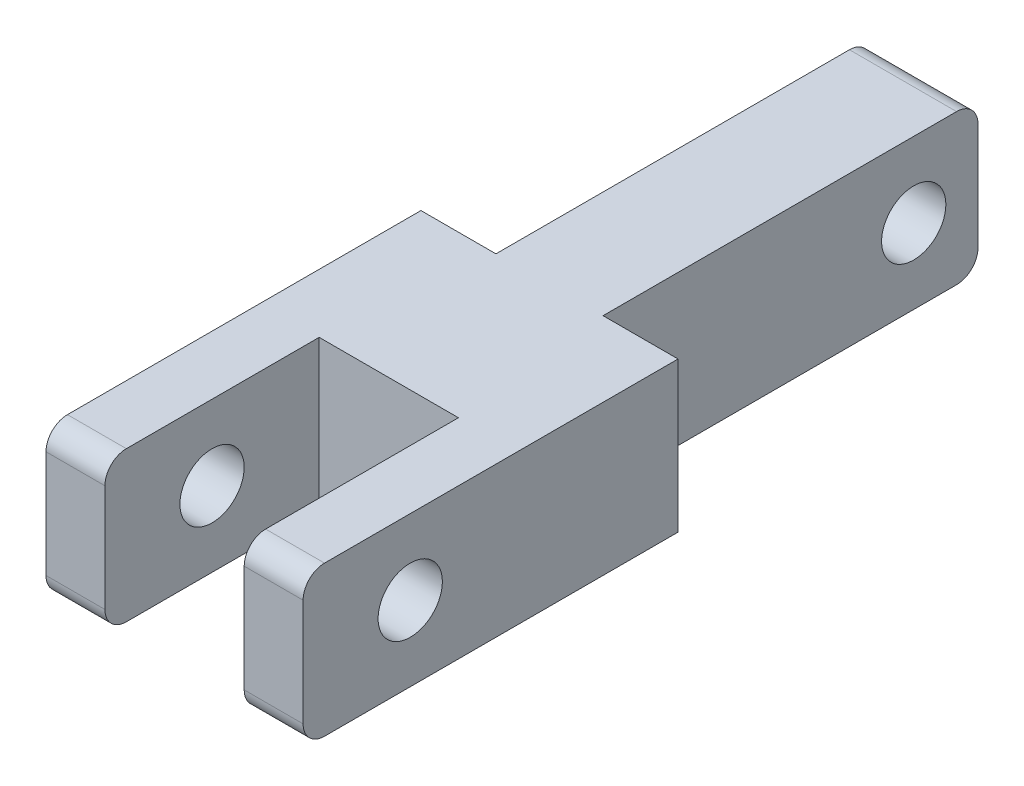
ISO-10303-21;
HEADER;
FILE_DESCRIPTION(('STEP AP214'),'2;1');
FILE_NAME('part.step','',(''),(''),'','','');
FILE_SCHEMA(('AUTOMOTIVE_DESIGN { 1 0 10303 214 1 1 1 1 }'));
ENDSEC;
DATA;
#1=APPLICATION_CONTEXT('core data for automotive mechanical design processes');
#2=APPLICATION_PROTOCOL_DEFINITION('international standard','automotive_design',2000,#1);
#3=PRODUCT_CONTEXT('',#1,'mechanical');
#4=PRODUCT('Part','Part','',(#3));
#5=PRODUCT_RELATED_PRODUCT_CATEGORY('part','',(#4));
#6=PRODUCT_DEFINITION_FORMATION('','',#4);
#7=PRODUCT_DEFINITION_CONTEXT('part definition',#1,'design');
#8=PRODUCT_DEFINITION('design','',#6,#7);
#9=PRODUCT_DEFINITION_SHAPE('','',#8);
#10=(LENGTH_UNIT() NAMED_UNIT(*) SI_UNIT(.MILLI.,.METRE.));
#11=(NAMED_UNIT(*) PLANE_ANGLE_UNIT() SI_UNIT($,.RADIAN.));
#12=(NAMED_UNIT(*) SI_UNIT($,.STERADIAN.) SOLID_ANGLE_UNIT());
#13=UNCERTAINTY_MEASURE_WITH_UNIT(LENGTH_MEASURE(1.E-05),#10,'distance_accuracy_value','');
#14=(GEOMETRIC_REPRESENTATION_CONTEXT(3) GLOBAL_UNCERTAINTY_ASSIGNED_CONTEXT((#13)) GLOBAL_UNIT_ASSIGNED_CONTEXT((#10,
#11,#12)) REPRESENTATION_CONTEXT('',''));
#15=CARTESIAN_POINT('',(0.,0.,0.));
#16=DIRECTION('',(0.,0.,1.));
#17=DIRECTION('',(1.,0.,0.));
#18=AXIS2_PLACEMENT_3D('',#15,#16,#17);
#19=CARTESIAN_POINT('',(2.5,-2.5,16.5));
#20=DIRECTION('',(-1.,0.,0.));
#21=DIRECTION('',(0.,0.,1.));
#22=AXIS2_PLACEMENT_3D('',#19,#20,#21);
#23=CYLINDRICAL_SURFACE('',#22,0.999999999999999);
#24=CARTESIAN_POINT('',(-3.25,-2.5,16.5));
#25=DIRECTION('',(1.,0.,0.));
#26=DIRECTION('',(0.,0.,-1.));
#27=AXIS2_PLACEMENT_3D('',#24,#25,#26);
#28=CIRCLE('',#27,0.999999999999998);
#29=CARTESIAN_POINT('',(-3.25,-2.5,17.5));
#30=VERTEX_POINT('',#29);
#31=CARTESIAN_POINT('',(-3.25,-3.5,16.5));
#32=VERTEX_POINT('',#31);
#33=EDGE_CURVE('E178',#30,#32,#28,.T.);
#34=ORIENTED_EDGE('',*,*,#33,.F.);
#35=DIRECTION('',(-1.,0.,0.));
#36=VECTOR('',#35,1.);
#37=CARTESIAN_POINT('',(2.5,-2.5,17.5));
#38=LINE('',#37,#36);
#39=CARTESIAN_POINT('',(-6.,-2.5,17.5));
#40=VERTEX_POINT('',#39);
#41=EDGE_CURVE('E177',#30,#40,#38,.T.);
#42=ORIENTED_EDGE('',*,*,#41,.T.);
#43=CARTESIAN_POINT('',(-6.,-2.5,16.5));
#44=DIRECTION('',(1.,0.,0.));
#45=DIRECTION('',(0.,0.,-1.));
#46=AXIS2_PLACEMENT_3D('',#43,#44,#45);
#47=CIRCLE('',#46,0.999999999999999);
#48=CARTESIAN_POINT('',(-6.,-3.5,16.5));
#49=VERTEX_POINT('',#48);
#50=EDGE_CURVE('E252',#40,#49,#47,.T.);
#51=ORIENTED_EDGE('',*,*,#50,.T.);
#52=DIRECTION('',(-1.,0.,0.));
#53=VECTOR('',#52,1.);
#54=CARTESIAN_POINT('',(2.5,-3.5,16.5));
#55=LINE('',#54,#53);
#56=EDGE_CURVE('E208',#32,#49,#55,.T.);
#57=ORIENTED_EDGE('',*,*,#56,.F.);
#58=EDGE_LOOP('',(#34,#42,#51,#57));
#59=FACE_BOUND('',#58,.T.);
#60=ADVANCED_FACE('F32',(#59),#23,.T.);
#61=CARTESIAN_POINT('',(2.5,-3.5,16.5));
#62=DIRECTION('',(0.,1.,0.));
#63=DIRECTION('',(0.,0.,1.));
#64=AXIS2_PLACEMENT_3D('',#61,#62,#63);
#65=PLANE('',#64);
#66=DIRECTION('',(0.,0.,-1.));
#67=VECTOR('',#66,1.);
#68=CARTESIAN_POINT('',(-3.25,-3.5,7.5));
#69=LINE('',#68,#67);
#70=CARTESIAN_POINT('',(-3.25,-3.5,7.5));
#71=VERTEX_POINT('',#70);
#72=EDGE_CURVE('E323',#32,#71,#69,.T.);
#73=ORIENTED_EDGE('',*,*,#72,.F.);
#74=ORIENTED_EDGE('',*,*,#56,.T.);
#75=DIRECTION('',(0.,0.,-1.));
#76=VECTOR('',#75,1.);
#77=CARTESIAN_POINT('',(-6.,-3.5,0.));
#78=LINE('',#77,#76);
#79=CARTESIAN_POINT('',(-6.,-3.5,0.));
#80=VERTEX_POINT('',#79);
#81=EDGE_CURVE('E255',#49,#80,#78,.T.);
#82=ORIENTED_EDGE('',*,*,#81,.T.);
#83=DIRECTION('',(-1.,0.,0.));
#84=VECTOR('',#83,1.);
#85=CARTESIAN_POINT('',(6.,-3.5,0.));
#86=LINE('',#85,#84);
#87=CARTESIAN_POINT('',(-2.5,-3.5,0.));
#88=VERTEX_POINT('',#87);
#89=EDGE_CURVE('E266',#88,#80,#86,.T.);
#90=ORIENTED_EDGE('',*,*,#89,.F.);
#91=DIRECTION('',(0.,0.,-1.));
#92=VECTOR('',#91,1.);
#93=CARTESIAN_POINT('',(-2.5,-3.5,16.5));
#94=LINE('',#93,#92);
#95=CARTESIAN_POINT('',(-2.5,-3.5,-16.5));
#96=VERTEX_POINT('',#95);
#97=EDGE_CURVE('E278',#88,#96,#94,.T.);
#98=ORIENTED_EDGE('',*,*,#97,.T.);
#99=DIRECTION('',(-1.,0.,0.));
#100=VECTOR('',#99,1.);
#101=CARTESIAN_POINT('',(2.5,-3.5,-16.5));
#102=LINE('',#101,#100);
#103=CARTESIAN_POINT('',(2.5,-3.5,-16.5));
#104=VERTEX_POINT('',#103);
#105=EDGE_CURVE('E205',#104,#96,#102,.T.);
#106=ORIENTED_EDGE('',*,*,#105,.F.);
#107=DIRECTION('',(0.,0.,-1.));
#108=VECTOR('',#107,1.);
#109=CARTESIAN_POINT('',(2.5,-3.5,16.5));
#110=LINE('',#109,#108);
#111=CARTESIAN_POINT('',(2.5,-3.5,0.));
#112=VERTEX_POINT('',#111);
#113=EDGE_CURVE('E279',#112,#104,#110,.T.);
#114=ORIENTED_EDGE('',*,*,#113,.F.);
#115=CARTESIAN_POINT('',(6.,-3.5,0.));
#116=VERTEX_POINT('',#115);
#117=EDGE_CURVE('E267',#116,#112,#86,.T.);
#118=ORIENTED_EDGE('',*,*,#117,.F.);
#119=DIRECTION('',(0.,0.,-1.));
#120=VECTOR('',#119,1.);
#121=CARTESIAN_POINT('',(6.,-3.5,0.));
#122=LINE('',#121,#120);
#123=CARTESIAN_POINT('',(6.,-3.5,16.5));
#124=VERTEX_POINT('',#123);
#125=EDGE_CURVE('E241',#124,#116,#122,.T.);
#126=ORIENTED_EDGE('',*,*,#125,.F.);
#127=CARTESIAN_POINT('',(3.25,-3.5,16.5));
#128=VERTEX_POINT('',#127);
#129=EDGE_CURVE('E41',#124,#128,#55,.T.);
#130=ORIENTED_EDGE('',*,*,#129,.T.);
#131=DIRECTION('',(0.,0.,-1.));
#132=VECTOR('',#131,1.);
#133=CARTESIAN_POINT('',(3.25,-3.5,7.5));
#134=LINE('',#133,#132);
#135=CARTESIAN_POINT('',(3.25,-3.5,7.5));
#136=VERTEX_POINT('',#135);
#137=EDGE_CURVE('E333',#128,#136,#134,.T.);
#138=ORIENTED_EDGE('',*,*,#137,.T.);
#139=DIRECTION('',(1.,0.,0.));
#140=VECTOR('',#139,1.);
#141=CARTESIAN_POINT('',(-3.25,-3.5,7.5));
#142=LINE('',#141,#140);
#143=EDGE_CURVE('E218',#71,#136,#142,.T.);
#144=ORIENTED_EDGE('',*,*,#143,.F.);
#145=EDGE_LOOP('',(#73,#74,#82,#90,#98,#106,#114,#118,#126,#130,#138,#144));
#146=FACE_BOUND('',#145,.T.);
#147=ADVANCED_FACE('F311',(#146),#65,.F.);
#148=CARTESIAN_POINT('',(2.5,3.5,16.5));
#149=DIRECTION('',(0.,-1.,0.));
#150=DIRECTION('',(0.,0.,-1.));
#151=AXIS2_PLACEMENT_3D('',#148,#149,#150);
#152=PLANE('',#151);
#153=DIRECTION('',(0.,0.,1.));
#154=VECTOR('',#153,1.);
#155=CARTESIAN_POINT('',(-3.25,3.5,16.5));
#156=LINE('',#155,#154);
#157=CARTESIAN_POINT('',(-3.25,3.5,7.5));
#158=VERTEX_POINT('',#157);
#159=CARTESIAN_POINT('',(-3.25,3.5,16.5));
#160=VERTEX_POINT('',#159);
#161=EDGE_CURVE('E165',#158,#160,#156,.T.);
#162=ORIENTED_EDGE('',*,*,#161,.F.);
#163=DIRECTION('',(1.,0.,0.));
#164=VECTOR('',#163,1.);
#165=CARTESIAN_POINT('',(-3.25,3.5,7.5));
#166=LINE('',#165,#164);
#167=CARTESIAN_POINT('',(3.25,3.5,7.5));
#168=VERTEX_POINT('',#167);
#169=EDGE_CURVE('E212',#158,#168,#166,.T.);
#170=ORIENTED_EDGE('',*,*,#169,.T.);
#171=DIRECTION('',(0.,0.,1.));
#172=VECTOR('',#171,1.);
#173=CARTESIAN_POINT('',(3.25,3.5,16.5));
#174=LINE('',#173,#172);
#175=CARTESIAN_POINT('',(3.25,3.5,16.5));
#176=VERTEX_POINT('',#175);
#177=EDGE_CURVE('E169',#168,#176,#174,.T.);
#178=ORIENTED_EDGE('',*,*,#177,.T.);
#179=DIRECTION('',(-1.,0.,0.));
#180=VECTOR('',#179,1.);
#181=CARTESIAN_POINT('',(2.5,3.5,16.5));
#182=LINE('',#181,#180);
#183=CARTESIAN_POINT('',(6.,3.5,16.5));
#184=VERTEX_POINT('',#183);
#185=EDGE_CURVE('E193',#184,#176,#182,.T.);
#186=ORIENTED_EDGE('',*,*,#185,.F.);
#187=DIRECTION('',(0.,0.,1.));
#188=VECTOR('',#187,1.);
#189=CARTESIAN_POINT('',(6.,3.5,16.5));
#190=LINE('',#189,#188);
#191=CARTESIAN_POINT('',(6.,3.5,0.));
#192=VERTEX_POINT('',#191);
#193=EDGE_CURVE('E245',#192,#184,#190,.T.);
#194=ORIENTED_EDGE('',*,*,#193,.F.);
#195=DIRECTION('',(-1.,0.,0.));
#196=VECTOR('',#195,1.);
#197=CARTESIAN_POINT('',(6.,3.5,0.));
#198=LINE('',#197,#196);
#199=CARTESIAN_POINT('',(2.5,3.5,0.));
#200=VERTEX_POINT('',#199);
#201=EDGE_CURVE('E263',#192,#200,#198,.T.);
#202=ORIENTED_EDGE('',*,*,#201,.T.);
#203=DIRECTION('',(0.,0.,1.));
#204=VECTOR('',#203,1.);
#205=CARTESIAN_POINT('',(2.5,3.5,16.5));
#206=LINE('',#205,#204);
#207=CARTESIAN_POINT('',(2.5,3.5,-16.5));
#208=VERTEX_POINT('',#207);
#209=EDGE_CURVE('E57',#208,#200,#206,.T.);
#210=ORIENTED_EDGE('',*,*,#209,.F.);
#211=DIRECTION('',(-1.,0.,0.));
#212=VECTOR('',#211,1.);
#213=CARTESIAN_POINT('',(2.5,3.5,-16.5));
#214=LINE('',#213,#212);
#215=CARTESIAN_POINT('',(-2.5,3.5,-16.5));
#216=VERTEX_POINT('',#215);
#217=EDGE_CURVE('E196',#208,#216,#214,.T.);
#218=ORIENTED_EDGE('',*,*,#217,.T.);
#219=DIRECTION('',(0.,0.,1.));
#220=VECTOR('',#219,1.);
#221=CARTESIAN_POINT('',(-2.5,3.5,16.5));
#222=LINE('',#221,#220);
#223=CARTESIAN_POINT('',(-2.5,3.5,0.));
#224=VERTEX_POINT('',#223);
#225=EDGE_CURVE('E282',#216,#224,#222,.T.);
#226=ORIENTED_EDGE('',*,*,#225,.T.);
#227=CARTESIAN_POINT('',(-6.,3.5,0.));
#228=VERTEX_POINT('',#227);
#229=EDGE_CURVE('E248',#224,#228,#198,.T.);
#230=ORIENTED_EDGE('',*,*,#229,.T.);
#231=DIRECTION('',(0.,0.,1.));
#232=VECTOR('',#231,1.);
#233=CARTESIAN_POINT('',(-6.,3.5,16.5));
#234=LINE('',#233,#232);
#235=CARTESIAN_POINT('',(-6.,3.5,16.5));
#236=VERTEX_POINT('',#235);
#237=EDGE_CURVE('E235',#228,#236,#234,.T.);
#238=ORIENTED_EDGE('',*,*,#237,.T.);
#239=EDGE_CURVE('E188',#160,#236,#182,.T.);
#240=ORIENTED_EDGE('',*,*,#239,.F.);
#241=EDGE_LOOP('',(#162,#170,#178,#186,#194,#202,#210,#218,#226,#230,#238,#240));
#242=FACE_BOUND('',#241,.T.);
#243=ADVANCED_FACE('F297',(#242),#152,.F.);
#244=CARTESIAN_POINT('',(2.5,2.5,16.5));
#245=DIRECTION('',(-1.,0.,0.));
#246=DIRECTION('',(0.,0.,1.));
#247=AXIS2_PLACEMENT_3D('',#244,#245,#246);
#248=CYLINDRICAL_SURFACE('',#247,0.999999999999999);
#249=CARTESIAN_POINT('',(-3.25,2.5,16.5));
#250=DIRECTION('',(1.,0.,0.));
#251=DIRECTION('',(0.,0.,-1.));
#252=AXIS2_PLACEMENT_3D('',#249,#250,#251);
#253=CIRCLE('',#252,0.999999999999998);
#254=CARTESIAN_POINT('',(-3.25,2.5,17.5));
#255=VERTEX_POINT('',#254);
#256=EDGE_CURVE('E157',#160,#255,#253,.T.);
#257=ORIENTED_EDGE('',*,*,#256,.F.);
#258=ORIENTED_EDGE('',*,*,#239,.T.);
#259=CARTESIAN_POINT('',(-6.,2.5,16.5));
#260=DIRECTION('',(1.,0.,0.));
#261=DIRECTION('',(0.,0.,-1.));
#262=AXIS2_PLACEMENT_3D('',#259,#260,#261);
#263=CIRCLE('',#262,0.999999999999998);
#264=CARTESIAN_POINT('',(-6.,2.5,17.5));
#265=VERTEX_POINT('',#264);
#266=EDGE_CURVE('E183',#236,#265,#263,.T.);
#267=ORIENTED_EDGE('',*,*,#266,.T.);
#268=DIRECTION('',(-1.,0.,0.));
#269=VECTOR('',#268,1.);
#270=CARTESIAN_POINT('',(2.5,2.5,17.5));
#271=LINE('',#270,#269);
#272=EDGE_CURVE('E175',#255,#265,#271,.T.);
#273=ORIENTED_EDGE('',*,*,#272,.F.);
#274=EDGE_LOOP('',(#257,#258,#267,#273));
#275=FACE_BOUND('',#274,.T.);
#276=ADVANCED_FACE('F181',(#275),#248,.T.);
#277=CARTESIAN_POINT('',(2.5,2.5,17.5));
#278=DIRECTION('',(0.,0.,-1.));
#279=DIRECTION('',(-1.,0.,0.));
#280=AXIS2_PLACEMENT_3D('',#277,#278,#279);
#281=PLANE('',#280);
#282=DIRECTION('',(0.,-1.,0.));
#283=VECTOR('',#282,1.);
#284=CARTESIAN_POINT('',(-3.25,2.5,17.5));
#285=LINE('',#284,#283);
#286=EDGE_CURVE('E161',#255,#30,#285,.T.);
#287=ORIENTED_EDGE('',*,*,#286,.F.);
#288=ORIENTED_EDGE('',*,*,#272,.T.);
#289=DIRECTION('',(0.,-1.,0.));
#290=VECTOR('',#289,1.);
#291=CARTESIAN_POINT('',(-6.,2.5,17.5));
#292=LINE('',#291,#290);
#293=EDGE_CURVE('E250',#265,#40,#292,.T.);
#294=ORIENTED_EDGE('',*,*,#293,.T.);
#295=ORIENTED_EDGE('',*,*,#41,.F.);
#296=EDGE_LOOP('',(#287,#288,#294,#295));
#297=FACE_BOUND('',#296,.T.);
#298=ADVANCED_FACE('F173',(#297),#281,.F.);
#299=CARTESIAN_POINT('',(-2.5,0.,12.5));
#300=DIRECTION('',(1.,0.,0.));
#301=DIRECTION('',(0.,0.,-1.));
#302=AXIS2_PLACEMENT_3D('',#299,#300,#301);
#303=CYLINDRICAL_SURFACE('',#302,1.5);
#304=CARTESIAN_POINT('',(-6.,0.,12.5));
#305=DIRECTION('',(1.,0.,0.));
#306=DIRECTION('',(0.,0.,-1.));
#307=AXIS2_PLACEMENT_3D('',#304,#305,#306);
#308=CIRCLE('',#307,1.5);
#309=CARTESIAN_POINT('',(-6.,0.,11.));
#310=VERTEX_POINT('',#309);
#311=EDGE_CURVE('E216',#310,#310,#308,.T.);
#312=ORIENTED_EDGE('',*,*,#311,.F.);
#313=EDGE_LOOP('',(#312));
#314=FACE_BOUND('',#313,.T.);
#315=CARTESIAN_POINT('',(-3.25,0.,12.5));
#316=DIRECTION('',(1.,0.,0.));
#317=DIRECTION('',(0.,0.,-1.));
#318=AXIS2_PLACEMENT_3D('',#315,#316,#317);
#319=CIRCLE('',#318,1.5);
#320=CARTESIAN_POINT('',(-3.25,0.,11.));
#321=VERTEX_POINT('',#320);
#322=EDGE_CURVE('E36',#321,#321,#319,.F.);
#323=ORIENTED_EDGE('',*,*,#322,.F.);
#324=EDGE_LOOP('',(#323));
#325=FACE_BOUND('',#324,.T.);
#326=ADVANCED_FACE('F413',(#314,#325),#303,.F.);
#327=CARTESIAN_POINT('',(2.5,-2.5,16.5));
#328=DIRECTION('',(1.,0.,0.));
#329=DIRECTION('',(0.,0.,-1.));
#330=AXIS2_PLACEMENT_3D('',#327,#328,#329);
#331=PLANE('',#330);
#332=CARTESIAN_POINT('',(2.5,0.,-14.5));
#333=DIRECTION('',(1.,0.,0.));
#334=DIRECTION('',(0.,0.,-1.));
#335=AXIS2_PLACEMENT_3D('',#332,#333,#334);
#336=CIRCLE('',#335,1.5);
#337=CARTESIAN_POINT('',(2.5,0.,-16.));
#338=VERTEX_POINT('',#337);
#339=EDGE_CURVE('E272',#338,#338,#336,.T.);
#340=ORIENTED_EDGE('',*,*,#339,.F.);
#341=EDGE_LOOP('',(#340));
#342=FACE_BOUND('',#341,.T.);
#343=ORIENTED_EDGE('',*,*,#209,.T.);
#344=DIRECTION('',(0.,-1.,0.));
#345=VECTOR('',#344,1.);
#346=CARTESIAN_POINT('',(2.5,-2.5,0.));
#347=LINE('',#346,#345);
#348=EDGE_CURVE('E270',#200,#112,#347,.T.);
#349=ORIENTED_EDGE('',*,*,#348,.T.);
#350=ORIENTED_EDGE('',*,*,#113,.T.);
#351=CARTESIAN_POINT('',(2.5,-2.5,-16.5));
#352=DIRECTION('',(1.,0.,0.));
#353=DIRECTION('',(0.,0.,-1.));
#354=AXIS2_PLACEMENT_3D('',#351,#352,#353);
#355=CIRCLE('',#354,1.);
#356=CARTESIAN_POINT('',(2.5,-2.5,-17.5));
#357=VERTEX_POINT('',#356);
#358=EDGE_CURVE('E281',#104,#357,#355,.T.);
#359=ORIENTED_EDGE('',*,*,#358,.T.);
#360=DIRECTION('',(0.,1.,0.));
#361=VECTOR('',#360,1.);
#362=CARTESIAN_POINT('',(2.5,2.5,-17.5));
#363=LINE('',#362,#361);
#364=CARTESIAN_POINT('',(2.5,2.5,-17.5));
#365=VERTEX_POINT('',#364);
#366=EDGE_CURVE('E284',#357,#365,#363,.T.);
#367=ORIENTED_EDGE('',*,*,#366,.T.);
#368=CARTESIAN_POINT('',(2.5,2.5,-16.5));
#369=DIRECTION('',(1.,0.,0.));
#370=DIRECTION('',(0.,0.,1.));
#371=AXIS2_PLACEMENT_3D('',#368,#369,#370);
#372=CIRCLE('',#371,1.);
#373=EDGE_CURVE('E286',#365,#208,#372,.T.);
#374=ORIENTED_EDGE('',*,*,#373,.T.);
#375=EDGE_LOOP('',(#343,#349,#350,#359,#367,#374));
#376=FACE_BOUND('',#375,.T.);
#377=ADVANCED_FACE('F354',(#342,#376),#331,.T.);
#378=CARTESIAN_POINT('',(-2.5,-2.5,16.5));
#379=DIRECTION('',(1.,0.,0.));
#380=DIRECTION('',(0.,0.,-1.));
#381=AXIS2_PLACEMENT_3D('',#378,#379,#380);
#382=PLANE('',#381);
#383=CARTESIAN_POINT('',(-2.5,0.,-14.5));
#384=DIRECTION('',(1.,0.,0.));
#385=DIRECTION('',(0.,0.,-1.));
#386=AXIS2_PLACEMENT_3D('',#383,#384,#385);
#387=CIRCLE('',#386,1.5);
#388=CARTESIAN_POINT('',(-2.5,0.,-16.));
#389=VERTEX_POINT('',#388);
#390=EDGE_CURVE('E275',#389,#389,#387,.T.);
#391=ORIENTED_EDGE('',*,*,#390,.T.);
#392=EDGE_LOOP('',(#391));
#393=FACE_BOUND('',#392,.T.);
#394=DIRECTION('',(0.,-1.,0.));
#395=VECTOR('',#394,1.);
#396=CARTESIAN_POINT('',(-2.5,-2.5,0.));
#397=LINE('',#396,#395);
#398=EDGE_CURVE('E11',#224,#88,#397,.T.);
#399=ORIENTED_EDGE('',*,*,#398,.F.);
#400=ORIENTED_EDGE('',*,*,#225,.F.);
#401=CARTESIAN_POINT('',(-2.5,2.5,-16.5));
#402=DIRECTION('',(1.,0.,0.));
#403=DIRECTION('',(0.,0.,1.));
#404=AXIS2_PLACEMENT_3D('',#401,#402,#403);
#405=CIRCLE('',#404,1.);
#406=CARTESIAN_POINT('',(-2.5,2.5,-17.5));
#407=VERTEX_POINT('',#406);
#408=EDGE_CURVE('E294',#407,#216,#405,.T.);
#409=ORIENTED_EDGE('',*,*,#408,.F.);
#410=DIRECTION('',(0.,1.,0.));
#411=VECTOR('',#410,1.);
#412=CARTESIAN_POINT('',(-2.5,2.5,-17.5));
#413=LINE('',#412,#411);
#414=CARTESIAN_POINT('',(-2.5,-2.5,-17.5));
#415=VERTEX_POINT('',#414);
#416=EDGE_CURVE('E292',#415,#407,#413,.T.);
#417=ORIENTED_EDGE('',*,*,#416,.F.);
#418=CARTESIAN_POINT('',(-2.5,-2.5,-16.5));
#419=DIRECTION('',(1.,0.,0.));
#420=DIRECTION('',(0.,0.,-1.));
#421=AXIS2_PLACEMENT_3D('',#418,#419,#420);
#422=CIRCLE('',#421,1.);
#423=EDGE_CURVE('E290',#96,#415,#422,.T.);
#424=ORIENTED_EDGE('',*,*,#423,.F.);
#425=ORIENTED_EDGE('',*,*,#97,.F.);
#426=EDGE_LOOP('',(#399,#400,#409,#417,#424,#425));
#427=FACE_BOUND('',#426,.T.);
#428=ADVANCED_FACE('F302',(#393,#427),#382,.F.);
#429=CARTESIAN_POINT('',(6.,-2.5,17.5));
#430=VERTEX_POINT('',#429);
#431=CARTESIAN_POINT('',(3.25,-2.5,17.5));
#432=VERTEX_POINT('',#431);
#433=EDGE_CURVE('E185',#430,#432,#38,.T.);
#434=ORIENTED_EDGE('',*,*,#433,.T.);
#435=CARTESIAN_POINT('',(3.25,-2.5,16.5));
#436=DIRECTION('',(1.,0.,0.));
#437=DIRECTION('',(0.,0.,-1.));
#438=AXIS2_PLACEMENT_3D('',#435,#436,#437);
#439=CIRCLE('',#438,0.999999999999998);
#440=EDGE_CURVE('E49',#432,#128,#439,.T.);
#441=ORIENTED_EDGE('',*,*,#440,.T.);
#442=ORIENTED_EDGE('',*,*,#129,.F.);
#443=CARTESIAN_POINT('',(6.,-2.5,16.5));
#444=DIRECTION('',(1.,0.,0.));
#445=DIRECTION('',(0.,0.,-1.));
#446=AXIS2_PLACEMENT_3D('',#443,#444,#445);
#447=CIRCLE('',#446,0.999999999999999);
#448=EDGE_CURVE('E238',#430,#124,#447,.T.);
#449=ORIENTED_EDGE('',*,*,#448,.F.);
#450=EDGE_LOOP('',(#434,#441,#442,#449));
#451=FACE_BOUND('',#450,.T.);
#452=ADVANCED_FACE('F34',(#451),#23,.T.);
#453=CARTESIAN_POINT('',(2.5,-2.5,-16.5));
#454=DIRECTION('',(-1.,0.,0.));
#455=DIRECTION('',(0.,0.,1.));
#456=AXIS2_PLACEMENT_3D('',#453,#454,#455);
#457=CYLINDRICAL_SURFACE('',#456,1.);
#458=ORIENTED_EDGE('',*,*,#423,.T.);
#459=DIRECTION('',(-1.,0.,0.));
#460=VECTOR('',#459,1.);
#461=CARTESIAN_POINT('',(2.5,-2.5,-17.5));
#462=LINE('',#461,#460);
#463=EDGE_CURVE('E202',#357,#415,#462,.T.);
#464=ORIENTED_EDGE('',*,*,#463,.F.);
#465=ORIENTED_EDGE('',*,*,#358,.F.);
#466=ORIENTED_EDGE('',*,*,#105,.T.);
#467=EDGE_LOOP('',(#458,#464,#465,#466));
#468=FACE_BOUND('',#467,.T.);
#469=ADVANCED_FACE('F359',(#468),#457,.T.);
#470=CARTESIAN_POINT('',(2.5,2.5,-17.5));
#471=DIRECTION('',(0.,0.,1.));
#472=DIRECTION('',(1.,0.,0.));
#473=AXIS2_PLACEMENT_3D('',#470,#471,#472);
#474=PLANE('',#473);
#475=ORIENTED_EDGE('',*,*,#416,.T.);
#476=DIRECTION('',(-1.,0.,0.));
#477=VECTOR('',#476,1.);
#478=CARTESIAN_POINT('',(2.5,2.5,-17.5));
#479=LINE('',#478,#477);
#480=EDGE_CURVE('E199',#365,#407,#479,.T.);
#481=ORIENTED_EDGE('',*,*,#480,.F.);
#482=ORIENTED_EDGE('',*,*,#366,.F.);
#483=ORIENTED_EDGE('',*,*,#463,.T.);
#484=EDGE_LOOP('',(#475,#481,#482,#483));
#485=FACE_BOUND('',#484,.T.);
#486=ADVANCED_FACE('F364',(#485),#474,.F.);
#487=CARTESIAN_POINT('',(2.5,2.5,-16.5));
#488=DIRECTION('',(-1.,0.,0.));
#489=DIRECTION('',(0.,0.,1.));
#490=AXIS2_PLACEMENT_3D('',#487,#488,#489);
#491=CYLINDRICAL_SURFACE('',#490,1.);
#492=ORIENTED_EDGE('',*,*,#408,.T.);
#493=ORIENTED_EDGE('',*,*,#217,.F.);
#494=ORIENTED_EDGE('',*,*,#373,.F.);
#495=ORIENTED_EDGE('',*,*,#480,.T.);
#496=EDGE_LOOP('',(#492,#493,#494,#495));
#497=FACE_BOUND('',#496,.T.);
#498=ADVANCED_FACE('F366',(#497),#491,.T.);
#499=ORIENTED_EDGE('',*,*,#185,.T.);
#500=CARTESIAN_POINT('',(3.25,2.5,16.5));
#501=DIRECTION('',(1.,0.,0.));
#502=DIRECTION('',(0.,0.,-1.));
#503=AXIS2_PLACEMENT_3D('',#500,#501,#502);
#504=CIRCLE('',#503,0.999999999999998);
#505=CARTESIAN_POINT('',(3.25,2.5,17.5));
#506=VERTEX_POINT('',#505);
#507=EDGE_CURVE('E327',#176,#506,#504,.T.);
#508=ORIENTED_EDGE('',*,*,#507,.T.);
#509=CARTESIAN_POINT('',(6.,2.5,17.5));
#510=VERTEX_POINT('',#509);
#511=EDGE_CURVE('E184',#510,#506,#271,.T.);
#512=ORIENTED_EDGE('',*,*,#511,.F.);
#513=CARTESIAN_POINT('',(6.,2.5,16.5));
#514=DIRECTION('',(1.,0.,0.));
#515=DIRECTION('',(0.,0.,-1.));
#516=AXIS2_PLACEMENT_3D('',#513,#514,#515);
#517=CIRCLE('',#516,0.999999999999998);
#518=EDGE_CURVE('E231',#184,#510,#517,.T.);
#519=ORIENTED_EDGE('',*,*,#518,.F.);
#520=EDGE_LOOP('',(#499,#508,#512,#519));
#521=FACE_BOUND('',#520,.T.);
#522=ADVANCED_FACE('F342',(#521),#248,.T.);
#523=ORIENTED_EDGE('',*,*,#511,.T.);
#524=DIRECTION('',(0.,-1.,0.));
#525=VECTOR('',#524,1.);
#526=CARTESIAN_POINT('',(3.25,2.5,17.5));
#527=LINE('',#526,#525);
#528=EDGE_CURVE('E330',#506,#432,#527,.T.);
#529=ORIENTED_EDGE('',*,*,#528,.T.);
#530=ORIENTED_EDGE('',*,*,#433,.F.);
#531=DIRECTION('',(0.,-1.,0.));
#532=VECTOR('',#531,1.);
#533=CARTESIAN_POINT('',(6.,2.5,17.5));
#534=LINE('',#533,#532);
#535=EDGE_CURVE('E234',#510,#430,#534,.T.);
#536=ORIENTED_EDGE('',*,*,#535,.F.);
#537=EDGE_LOOP('',(#523,#529,#530,#536));
#538=FACE_BOUND('',#537,.T.);
#539=ADVANCED_FACE('F373',(#538),#281,.F.);
#540=CARTESIAN_POINT('',(-2.5,0.,-14.5));
#541=DIRECTION('',(1.,0.,0.));
#542=DIRECTION('',(0.,0.,-1.));
#543=AXIS2_PLACEMENT_3D('',#540,#541,#542);
#544=CYLINDRICAL_SURFACE('',#543,1.5);
#545=ORIENTED_EDGE('',*,*,#390,.F.);
#546=EDGE_LOOP('',(#545));
#547=FACE_BOUND('',#546,.T.);
#548=ORIENTED_EDGE('',*,*,#339,.T.);
#549=EDGE_LOOP('',(#548));
#550=FACE_BOUND('',#549,.T.);
#551=ADVANCED_FACE('F414',(#547,#550),#544,.F.);
#552=CARTESIAN_POINT('',(6.,3.5,0.));
#553=DIRECTION('',(0.,0.,1.));
#554=DIRECTION('',(1.,0.,0.));
#555=AXIS2_PLACEMENT_3D('',#552,#553,#554);
#556=PLANE('',#555);
#557=ORIENTED_EDGE('',*,*,#229,.F.);
#558=ORIENTED_EDGE('',*,*,#398,.T.);
#559=ORIENTED_EDGE('',*,*,#89,.T.);
#560=DIRECTION('',(0.,1.,0.));
#561=VECTOR('',#560,1.);
#562=CARTESIAN_POINT('',(-6.,3.5,0.));
#563=LINE('',#562,#561);
#564=EDGE_CURVE('E258',#80,#228,#563,.T.);
#565=ORIENTED_EDGE('',*,*,#564,.T.);
#566=EDGE_LOOP('',(#557,#558,#559,#565));
#567=FACE_BOUND('',#566,.T.);
#568=ADVANCED_FACE('F308',(#567),#556,.F.);
#569=CARTESIAN_POINT('',(-6.,2.5,16.5));
#570=DIRECTION('',(1.,0.,0.));
#571=DIRECTION('',(0.,0.,-1.));
#572=AXIS2_PLACEMENT_3D('',#569,#570,#571);
#573=PLANE('',#572);
#574=ORIENTED_EDGE('',*,*,#266,.F.);
#575=ORIENTED_EDGE('',*,*,#237,.F.);
#576=ORIENTED_EDGE('',*,*,#564,.F.);
#577=ORIENTED_EDGE('',*,*,#81,.F.);
#578=ORIENTED_EDGE('',*,*,#50,.F.);
#579=ORIENTED_EDGE('',*,*,#293,.F.);
#580=EDGE_LOOP('',(#574,#575,#576,#577,#578,#579));
#581=FACE_BOUND('',#580,.T.);
#582=ORIENTED_EDGE('',*,*,#311,.T.);
#583=EDGE_LOOP('',(#582));
#584=FACE_BOUND('',#583,.T.);
#585=ADVANCED_FACE('F319',(#581,#584),#573,.F.);
#586=CARTESIAN_POINT('',(3.25,0.,12.5));
#587=DIRECTION('',(1.,0.,0.));
#588=DIRECTION('',(0.,0.,-1.));
#589=AXIS2_PLACEMENT_3D('',#586,#587,#588);
#590=CIRCLE('',#589,1.5);
#591=CARTESIAN_POINT('',(3.25,0.,11.));
#592=VERTEX_POINT('',#591);
#593=EDGE_CURVE('E210',#592,#592,#590,.F.);
#594=ORIENTED_EDGE('',*,*,#593,.T.);
#595=EDGE_LOOP('',(#594));
#596=FACE_BOUND('',#595,.T.);
#597=CARTESIAN_POINT('',(6.,0.,12.5));
#598=DIRECTION('',(1.,0.,0.));
#599=DIRECTION('',(0.,0.,-1.));
#600=AXIS2_PLACEMENT_3D('',#597,#598,#599);
#601=CIRCLE('',#600,1.5);
#602=CARTESIAN_POINT('',(6.,0.,11.));
#603=VERTEX_POINT('',#602);
#604=EDGE_CURVE('E226',#603,#603,#601,.T.);
#605=ORIENTED_EDGE('',*,*,#604,.T.);
#606=EDGE_LOOP('',(#605));
#607=FACE_BOUND('',#606,.T.);
#608=ADVANCED_FACE('F406',(#596,#607),#303,.F.);
#609=CARTESIAN_POINT('',(6.,2.5,16.5));
#610=DIRECTION('',(1.,0.,0.));
#611=DIRECTION('',(0.,0.,-1.));
#612=AXIS2_PLACEMENT_3D('',#609,#610,#611);
#613=PLANE('',#612);
#614=ORIENTED_EDGE('',*,*,#518,.T.);
#615=ORIENTED_EDGE('',*,*,#535,.T.);
#616=ORIENTED_EDGE('',*,*,#448,.T.);
#617=ORIENTED_EDGE('',*,*,#125,.T.);
#618=DIRECTION('',(0.,1.,0.));
#619=VECTOR('',#618,1.);
#620=CARTESIAN_POINT('',(6.,3.5,0.));
#621=LINE('',#620,#619);
#622=EDGE_CURVE('E243',#116,#192,#621,.T.);
#623=ORIENTED_EDGE('',*,*,#622,.T.);
#624=ORIENTED_EDGE('',*,*,#193,.T.);
#625=EDGE_LOOP('',(#614,#615,#616,#617,#623,#624));
#626=FACE_BOUND('',#625,.T.);
#627=ORIENTED_EDGE('',*,*,#604,.F.);
#628=EDGE_LOOP('',(#627));
#629=FACE_BOUND('',#628,.T.);
#630=ADVANCED_FACE('F345',(#626,#629),#613,.T.);
#631=ORIENTED_EDGE('',*,*,#348,.F.);
#632=ORIENTED_EDGE('',*,*,#201,.F.);
#633=ORIENTED_EDGE('',*,*,#622,.F.);
#634=ORIENTED_EDGE('',*,*,#117,.T.);
#635=EDGE_LOOP('',(#631,#632,#633,#634));
#636=FACE_BOUND('',#635,.T.);
#637=ADVANCED_FACE('F351',(#636),#556,.F.);
#638=CARTESIAN_POINT('',(-3.25,2.5,16.5));
#639=DIRECTION('',(1.,0.,0.));
#640=DIRECTION('',(0.,0.,-1.));
#641=AXIS2_PLACEMENT_3D('',#638,#639,#640);
#642=PLANE('',#641);
#643=ORIENTED_EDGE('',*,*,#256,.T.);
#644=ORIENTED_EDGE('',*,*,#286,.T.);
#645=ORIENTED_EDGE('',*,*,#33,.T.);
#646=ORIENTED_EDGE('',*,*,#72,.T.);
#647=DIRECTION('',(0.,1.,0.));
#648=VECTOR('',#647,1.);
#649=CARTESIAN_POINT('',(-3.25,3.5,7.5));
#650=LINE('',#649,#648);
#651=EDGE_CURVE('E321',#71,#158,#650,.T.);
#652=ORIENTED_EDGE('',*,*,#651,.T.);
#653=ORIENTED_EDGE('',*,*,#161,.T.);
#654=EDGE_LOOP('',(#643,#644,#645,#646,#652,#653));
#655=FACE_BOUND('',#654,.T.);
#656=ORIENTED_EDGE('',*,*,#322,.T.);
#657=EDGE_LOOP('',(#656));
#658=FACE_BOUND('',#657,.T.);
#659=ADVANCED_FACE('F159',(#655,#658),#642,.T.);
#660=CARTESIAN_POINT('',(3.25,2.5,16.5));
#661=DIRECTION('',(1.,0.,0.));
#662=DIRECTION('',(0.,0.,-1.));
#663=AXIS2_PLACEMENT_3D('',#660,#661,#662);
#664=PLANE('',#663);
#665=ORIENTED_EDGE('',*,*,#507,.F.);
#666=ORIENTED_EDGE('',*,*,#177,.F.);
#667=DIRECTION('',(0.,1.,0.));
#668=VECTOR('',#667,1.);
#669=CARTESIAN_POINT('',(3.25,3.5,7.5));
#670=LINE('',#669,#668);
#671=EDGE_CURVE('E335',#136,#168,#670,.T.);
#672=ORIENTED_EDGE('',*,*,#671,.F.);
#673=ORIENTED_EDGE('',*,*,#137,.F.);
#674=ORIENTED_EDGE('',*,*,#440,.F.);
#675=ORIENTED_EDGE('',*,*,#528,.F.);
#676=EDGE_LOOP('',(#665,#666,#672,#673,#674,#675));
#677=FACE_BOUND('',#676,.T.);
#678=ORIENTED_EDGE('',*,*,#593,.F.);
#679=EDGE_LOOP('',(#678));
#680=FACE_BOUND('',#679,.T.);
#681=ADVANCED_FACE('F392',(#677,#680),#664,.F.);
#682=CARTESIAN_POINT('',(-3.25,3.5,7.5));
#683=DIRECTION('',(0.,0.,-1.));
#684=DIRECTION('',(-1.,0.,0.));
#685=AXIS2_PLACEMENT_3D('',#682,#683,#684);
#686=PLANE('',#685);
#687=ORIENTED_EDGE('',*,*,#671,.T.);
#688=ORIENTED_EDGE('',*,*,#169,.F.);
#689=ORIENTED_EDGE('',*,*,#651,.F.);
#690=ORIENTED_EDGE('',*,*,#143,.T.);
#691=EDGE_LOOP('',(#687,#688,#689,#690));
#692=FACE_BOUND('',#691,.T.);
#693=ADVANCED_FACE('F395',(#692),#686,.F.);
#694=CLOSED_SHELL('',(#60,#147,#243,#276,#298,#326,#377,#428,#452,#469,#486,#498,#522,#539,#551,
#568,#585,#608,#630,#637,#659,#681,#693));
#695=MANIFOLD_SOLID_BREP('B2',#694);
#696=ADVANCED_BREP_SHAPE_REPRESENTATION('',(#18,#695),#14);
#697=SHAPE_DEFINITION_REPRESENTATION(#9,#696);
ENDSEC;
END-ISO-10303-21;
